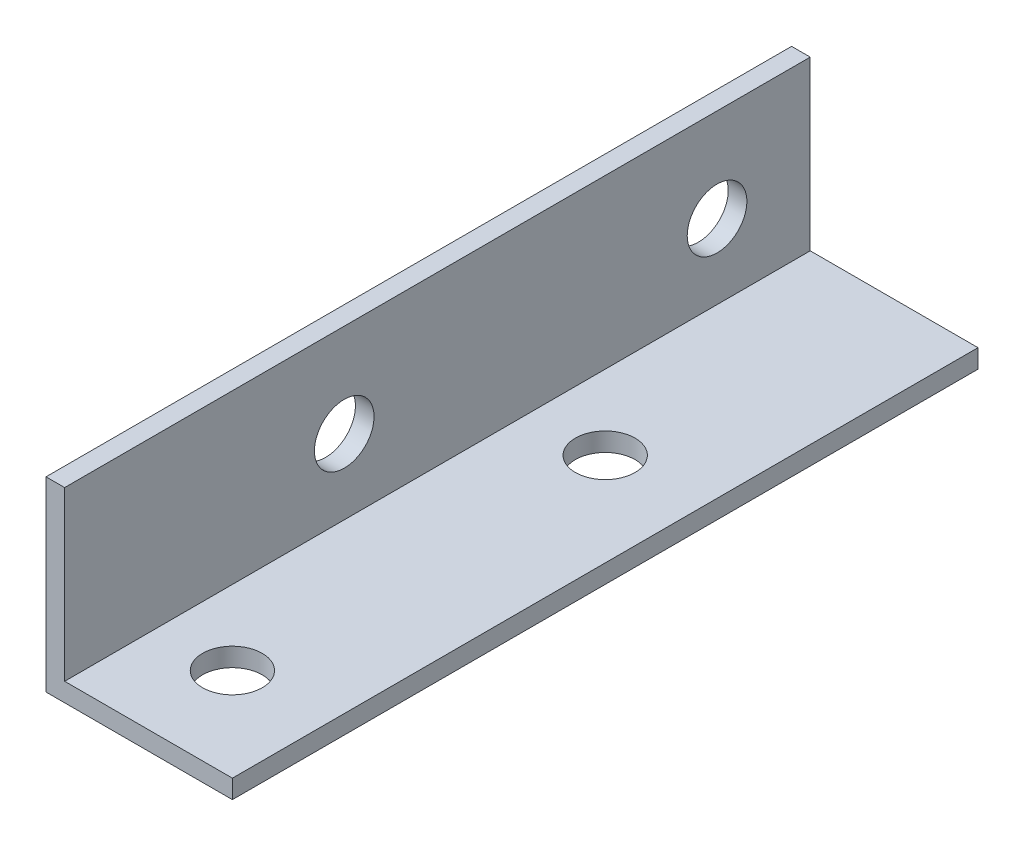
ISO-10303-21;
HEADER;
FILE_DESCRIPTION(('STEP AP214'),'2;1');
FILE_NAME('part.step','',(''),(''),'','','');
FILE_SCHEMA(('AUTOMOTIVE_DESIGN { 1 0 10303 214 1 1 1 1 }'));
ENDSEC;
DATA;
#1=APPLICATION_CONTEXT('core data for automotive mechanical design processes');
#2=APPLICATION_PROTOCOL_DEFINITION('international standard','automotive_design',2000,#1);
#3=PRODUCT_CONTEXT('',#1,'mechanical');
#4=PRODUCT('Part','Part','',(#3));
#5=PRODUCT_RELATED_PRODUCT_CATEGORY('part','',(#4));
#6=PRODUCT_DEFINITION_FORMATION('','',#4);
#7=PRODUCT_DEFINITION_CONTEXT('part definition',#1,'design');
#8=PRODUCT_DEFINITION('design','',#6,#7);
#9=PRODUCT_DEFINITION_SHAPE('','',#8);
#10=(LENGTH_UNIT() NAMED_UNIT(*) SI_UNIT(.MILLI.,.METRE.));
#11=(NAMED_UNIT(*) PLANE_ANGLE_UNIT() SI_UNIT($,.RADIAN.));
#12=(NAMED_UNIT(*) SI_UNIT($,.STERADIAN.) SOLID_ANGLE_UNIT());
#13=UNCERTAINTY_MEASURE_WITH_UNIT(LENGTH_MEASURE(1.E-05),#10,'distance_accuracy_value','');
#14=(GEOMETRIC_REPRESENTATION_CONTEXT(3) GLOBAL_UNCERTAINTY_ASSIGNED_CONTEXT((#13)) GLOBAL_UNIT_ASSIGNED_CONTEXT((#10,
#11,#12)) REPRESENTATION_CONTEXT('',''));
#15=CARTESIAN_POINT('',(0.,0.,0.));
#16=DIRECTION('',(0.,0.,1.));
#17=DIRECTION('',(1.,0.,0.));
#18=AXIS2_PLACEMENT_3D('',#15,#16,#17);
#19=CARTESIAN_POINT('',(-5.,-5.,40.));
#20=DIRECTION('',(1.,0.,0.));
#21=DIRECTION('',(0.,0.,-1.));
#22=AXIS2_PLACEMENT_3D('',#19,#20,#21);
#23=PLANE('',#22);
#24=CARTESIAN_POINT('',(-5.,0.,5.));
#25=DIRECTION('',(-1.,0.,0.));
#26=DIRECTION('',(0.,0.,1.));
#27=AXIS2_PLACEMENT_3D('',#24,#25,#26);
#28=CIRCLE('',#27,1.6);
#29=CARTESIAN_POINT('',(-5.,0.,6.6));
#30=VERTEX_POINT('',#29);
#31=EDGE_CURVE('E144',#30,#30,#28,.T.);
#32=ORIENTED_EDGE('',*,*,#31,.F.);
#33=EDGE_LOOP('',(#32));
#34=FACE_BOUND('',#33,.T.);
#35=CARTESIAN_POINT('',(-5.,0.,25.));
#36=DIRECTION('',(-1.,0.,0.));
#37=DIRECTION('',(0.,0.,1.));
#38=AXIS2_PLACEMENT_3D('',#35,#36,#37);
#39=CIRCLE('',#38,1.6);
#40=CARTESIAN_POINT('',(-5.,0.,26.6));
#41=VERTEX_POINT('',#40);
#42=EDGE_CURVE('E149',#41,#41,#39,.T.);
#43=ORIENTED_EDGE('',*,*,#42,.F.);
#44=EDGE_LOOP('',(#43));
#45=FACE_BOUND('',#44,.T.);
#46=DIRECTION('',(0.,-1.,0.));
#47=VECTOR('',#46,1.);
#48=CARTESIAN_POINT('',(-5.,-5.,0.));
#49=LINE('',#48,#47);
#50=CARTESIAN_POINT('',(-5.,5.,0.));
#51=VERTEX_POINT('',#50);
#52=CARTESIAN_POINT('',(-5.,-5.,0.));
#53=VERTEX_POINT('',#52);
#54=EDGE_CURVE('E119',#51,#53,#49,.T.);
#55=ORIENTED_EDGE('',*,*,#54,.T.);
#56=DIRECTION('',(0.,0.,-1.));
#57=VECTOR('',#56,1.);
#58=CARTESIAN_POINT('',(-5.,-5.,40.));
#59=LINE('',#58,#57);
#60=CARTESIAN_POINT('',(-5.,-5.,40.));
#61=VERTEX_POINT('',#60);
#62=EDGE_CURVE('E11',#61,#53,#59,.T.);
#63=ORIENTED_EDGE('',*,*,#62,.F.);
#64=DIRECTION('',(0.,-1.,0.));
#65=VECTOR('',#64,1.);
#66=CARTESIAN_POINT('',(-5.,-5.,40.));
#67=LINE('',#66,#65);
#68=CARTESIAN_POINT('',(-5.,5.,40.));
#69=VERTEX_POINT('',#68);
#70=EDGE_CURVE('E130',#69,#61,#67,.T.);
#71=ORIENTED_EDGE('',*,*,#70,.F.);
#72=DIRECTION('',(0.,0.,-1.));
#73=VECTOR('',#72,1.);
#74=CARTESIAN_POINT('',(-5.,5.,40.));
#75=LINE('',#74,#73);
#76=EDGE_CURVE('E115',#69,#51,#75,.T.);
#77=ORIENTED_EDGE('',*,*,#76,.T.);
#78=EDGE_LOOP('',(#55,#63,#71,#77));
#79=FACE_BOUND('',#78,.T.);
#80=ADVANCED_FACE('F33',(#34,#45,#79),#23,.F.);
#81=CARTESIAN_POINT('',(5.,-5.,40.));
#82=DIRECTION('',(0.,1.,0.));
#83=DIRECTION('',(-1.,0.,0.));
#84=AXIS2_PLACEMENT_3D('',#81,#82,#83);
#85=PLANE('',#84);
#86=CARTESIAN_POINT('',(0.,-5.,15.));
#87=DIRECTION('',(0.,1.,0.));
#88=DIRECTION('',(-1.,0.,0.));
#89=AXIS2_PLACEMENT_3D('',#86,#87,#88);
#90=CIRCLE('',#89,1.6);
#91=CARTESIAN_POINT('',(-1.6,-5.,15.));
#92=VERTEX_POINT('',#91);
#93=EDGE_CURVE('E123',#92,#92,#90,.T.);
#94=ORIENTED_EDGE('',*,*,#93,.T.);
#95=EDGE_LOOP('',(#94));
#96=FACE_BOUND('',#95,.T.);
#97=CARTESIAN_POINT('',(0.,-5.,35.));
#98=DIRECTION('',(0.,1.,0.));
#99=DIRECTION('',(-1.,0.,0.));
#100=AXIS2_PLACEMENT_3D('',#97,#98,#99);
#101=CIRCLE('',#100,1.6);
#102=CARTESIAN_POINT('',(-1.6,-5.,35.));
#103=VERTEX_POINT('',#102);
#104=EDGE_CURVE('E139',#103,#103,#101,.T.);
#105=ORIENTED_EDGE('',*,*,#104,.T.);
#106=EDGE_LOOP('',(#105));
#107=FACE_BOUND('',#106,.T.);
#108=DIRECTION('',(1.,0.,0.));
#109=VECTOR('',#108,1.);
#110=CARTESIAN_POINT('',(5.,-5.,0.));
#111=LINE('',#110,#109);
#112=CARTESIAN_POINT('',(5.,-5.,0.));
#113=VERTEX_POINT('',#112);
#114=EDGE_CURVE('E122',#53,#113,#111,.T.);
#115=ORIENTED_EDGE('',*,*,#114,.T.);
#116=DIRECTION('',(0.,0.,-1.));
#117=VECTOR('',#116,1.);
#118=CARTESIAN_POINT('',(5.,-5.,40.));
#119=LINE('',#118,#117);
#120=CARTESIAN_POINT('',(5.,-5.,40.));
#121=VERTEX_POINT('',#120);
#122=EDGE_CURVE('E42',#121,#113,#119,.T.);
#123=ORIENTED_EDGE('',*,*,#122,.F.);
#124=DIRECTION('',(1.,0.,0.));
#125=VECTOR('',#124,1.);
#126=CARTESIAN_POINT('',(5.,-5.,40.));
#127=LINE('',#126,#125);
#128=EDGE_CURVE('E88',#61,#121,#127,.T.);
#129=ORIENTED_EDGE('',*,*,#128,.F.);
#130=ORIENTED_EDGE('',*,*,#62,.T.);
#131=EDGE_LOOP('',(#115,#123,#129,#130));
#132=FACE_BOUND('',#131,.T.);
#133=ADVANCED_FACE('F163',(#96,#107,#132),#85,.F.);
#134=CARTESIAN_POINT('',(5.,-5.,40.));
#135=DIRECTION('',(-1.,0.,0.));
#136=DIRECTION('',(0.,0.,1.));
#137=AXIS2_PLACEMENT_3D('',#134,#135,#136);
#138=PLANE('',#137);
#139=DIRECTION('',(0.,1.,0.));
#140=VECTOR('',#139,1.);
#141=CARTESIAN_POINT('',(5.,-5.,0.));
#142=LINE('',#141,#140);
#143=CARTESIAN_POINT('',(5.,-4.,0.));
#144=VERTEX_POINT('',#143);
#145=EDGE_CURVE('E125',#113,#144,#142,.T.);
#146=ORIENTED_EDGE('',*,*,#145,.T.);
#147=DIRECTION('',(0.,0.,-1.));
#148=VECTOR('',#147,1.);
#149=CARTESIAN_POINT('',(5.,-4.,40.));
#150=LINE('',#149,#148);
#151=CARTESIAN_POINT('',(5.,-4.,40.));
#152=VERTEX_POINT('',#151);
#153=EDGE_CURVE('E110',#152,#144,#150,.T.);
#154=ORIENTED_EDGE('',*,*,#153,.F.);
#155=DIRECTION('',(0.,1.,0.));
#156=VECTOR('',#155,1.);
#157=CARTESIAN_POINT('',(5.,-5.,40.));
#158=LINE('',#157,#156);
#159=EDGE_CURVE('E101',#121,#152,#158,.T.);
#160=ORIENTED_EDGE('',*,*,#159,.F.);
#161=ORIENTED_EDGE('',*,*,#122,.T.);
#162=EDGE_LOOP('',(#146,#154,#160,#161));
#163=FACE_BOUND('',#162,.T.);
#164=ADVANCED_FACE('F166',(#163),#138,.F.);
#165=CARTESIAN_POINT('',(-4.,-4.,40.));
#166=DIRECTION('',(0.,-1.,0.));
#167=DIRECTION('',(0.,0.,-1.));
#168=AXIS2_PLACEMENT_3D('',#165,#166,#167);
#169=PLANE('',#168);
#170=CARTESIAN_POINT('',(0.,-4.,15.));
#171=DIRECTION('',(0.,-1.,0.));
#172=DIRECTION('',(0.,0.,-1.));
#173=AXIS2_PLACEMENT_3D('',#170,#171,#172);
#174=CIRCLE('',#173,1.6);
#175=CARTESIAN_POINT('',(0.,-4.,13.4));
#176=VERTEX_POINT('',#175);
#177=EDGE_CURVE('E140',#176,#176,#174,.T.);
#178=ORIENTED_EDGE('',*,*,#177,.T.);
#179=EDGE_LOOP('',(#178));
#180=FACE_BOUND('',#179,.T.);
#181=CARTESIAN_POINT('',(0.,-4.,35.));
#182=DIRECTION('',(0.,-1.,0.));
#183=DIRECTION('',(0.,0.,-1.));
#184=AXIS2_PLACEMENT_3D('',#181,#182,#183);
#185=CIRCLE('',#184,1.6);
#186=CARTESIAN_POINT('',(0.,-4.,33.4));
#187=VERTEX_POINT('',#186);
#188=EDGE_CURVE('E136',#187,#187,#185,.T.);
#189=ORIENTED_EDGE('',*,*,#188,.T.);
#190=EDGE_LOOP('',(#189));
#191=FACE_BOUND('',#190,.T.);
#192=DIRECTION('',(-1.,0.,0.));
#193=VECTOR('',#192,1.);
#194=CARTESIAN_POINT('',(-4.,-4.,0.));
#195=LINE('',#194,#193);
#196=CARTESIAN_POINT('',(-4.,-4.,0.));
#197=VERTEX_POINT('',#196);
#198=EDGE_CURVE('E109',#144,#197,#195,.T.);
#199=ORIENTED_EDGE('',*,*,#198,.T.);
#200=DIRECTION('',(0.,0.,-1.));
#201=VECTOR('',#200,1.);
#202=CARTESIAN_POINT('',(-4.,-4.,40.));
#203=LINE('',#202,#201);
#204=CARTESIAN_POINT('',(-4.,-4.,40.));
#205=VERTEX_POINT('',#204);
#206=EDGE_CURVE('E106',#205,#197,#203,.T.);
#207=ORIENTED_EDGE('',*,*,#206,.F.);
#208=DIRECTION('',(-1.,0.,0.));
#209=VECTOR('',#208,1.);
#210=CARTESIAN_POINT('',(-4.,-4.,40.));
#211=LINE('',#210,#209);
#212=EDGE_CURVE('E95',#152,#205,#211,.T.);
#213=ORIENTED_EDGE('',*,*,#212,.F.);
#214=ORIENTED_EDGE('',*,*,#153,.T.);
#215=EDGE_LOOP('',(#199,#207,#213,#214));
#216=FACE_BOUND('',#215,.T.);
#217=ADVANCED_FACE('F107',(#180,#191,#216),#169,.F.);
#218=CARTESIAN_POINT('',(-4.,5.,40.));
#219=DIRECTION('',(-1.,0.,0.));
#220=DIRECTION('',(0.,0.,1.));
#221=AXIS2_PLACEMENT_3D('',#218,#219,#220);
#222=PLANE('',#221);
#223=CARTESIAN_POINT('',(-4.,0.,5.));
#224=DIRECTION('',(-1.,0.,0.));
#225=DIRECTION('',(0.,0.,1.));
#226=AXIS2_PLACEMENT_3D('',#223,#224,#225);
#227=CIRCLE('',#226,1.6);
#228=CARTESIAN_POINT('',(-4.,0.,6.6));
#229=VERTEX_POINT('',#228);
#230=EDGE_CURVE('E36',#229,#229,#227,.T.);
#231=ORIENTED_EDGE('',*,*,#230,.T.);
#232=EDGE_LOOP('',(#231));
#233=FACE_BOUND('',#232,.T.);
#234=CARTESIAN_POINT('',(-4.,0.,25.));
#235=DIRECTION('',(-1.,0.,0.));
#236=DIRECTION('',(0.,0.,1.));
#237=AXIS2_PLACEMENT_3D('',#234,#235,#236);
#238=CIRCLE('',#237,1.6);
#239=CARTESIAN_POINT('',(-4.,0.,26.6));
#240=VERTEX_POINT('',#239);
#241=EDGE_CURVE('E142',#240,#240,#238,.T.);
#242=ORIENTED_EDGE('',*,*,#241,.T.);
#243=EDGE_LOOP('',(#242));
#244=FACE_BOUND('',#243,.T.);
#245=DIRECTION('',(0.,1.,0.));
#246=VECTOR('',#245,1.);
#247=CARTESIAN_POINT('',(-4.,5.,0.));
#248=LINE('',#247,#246);
#249=CARTESIAN_POINT('',(-4.,5.,0.));
#250=VERTEX_POINT('',#249);
#251=EDGE_CURVE('E74',#197,#250,#248,.T.);
#252=ORIENTED_EDGE('',*,*,#251,.T.);
#253=DIRECTION('',(0.,0.,-1.));
#254=VECTOR('',#253,1.);
#255=CARTESIAN_POINT('',(-4.,5.,40.));
#256=LINE('',#255,#254);
#257=CARTESIAN_POINT('',(-4.,5.,40.));
#258=VERTEX_POINT('',#257);
#259=EDGE_CURVE('E111',#258,#250,#256,.T.);
#260=ORIENTED_EDGE('',*,*,#259,.F.);
#261=DIRECTION('',(0.,1.,0.));
#262=VECTOR('',#261,1.);
#263=CARTESIAN_POINT('',(-4.,5.,40.));
#264=LINE('',#263,#262);
#265=EDGE_CURVE('E99',#205,#258,#264,.T.);
#266=ORIENTED_EDGE('',*,*,#265,.F.);
#267=ORIENTED_EDGE('',*,*,#206,.T.);
#268=EDGE_LOOP('',(#252,#260,#266,#267));
#269=FACE_BOUND('',#268,.T.);
#270=ADVANCED_FACE('F113',(#233,#244,#269),#222,.F.);
#271=CARTESIAN_POINT('',(-4.,5.,40.));
#272=DIRECTION('',(0.,-1.,0.));
#273=DIRECTION('',(0.,0.,-1.));
#274=AXIS2_PLACEMENT_3D('',#271,#272,#273);
#275=PLANE('',#274);
#276=DIRECTION('',(-1.,0.,0.));
#277=VECTOR('',#276,1.);
#278=CARTESIAN_POINT('',(-4.,5.,0.));
#279=LINE('',#278,#277);
#280=EDGE_CURVE('E80',#250,#51,#279,.T.);
#281=ORIENTED_EDGE('',*,*,#280,.T.);
#282=ORIENTED_EDGE('',*,*,#76,.F.);
#283=DIRECTION('',(-1.,0.,0.));
#284=VECTOR('',#283,1.);
#285=CARTESIAN_POINT('',(-4.,5.,40.));
#286=LINE('',#285,#284);
#287=EDGE_CURVE('E51',#258,#69,#286,.T.);
#288=ORIENTED_EDGE('',*,*,#287,.F.);
#289=ORIENTED_EDGE('',*,*,#259,.T.);
#290=EDGE_LOOP('',(#281,#282,#288,#289));
#291=FACE_BOUND('',#290,.T.);
#292=ADVANCED_FACE('F171',(#291),#275,.F.);
#293=CARTESIAN_POINT('',(0.,0.,40.));
#294=DIRECTION('',(0.,0.,1.));
#295=DIRECTION('',(1.,0.,0.));
#296=AXIS2_PLACEMENT_3D('',#293,#294,#295);
#297=PLANE('',#296);
#298=ORIENTED_EDGE('',*,*,#70,.T.);
#299=ORIENTED_EDGE('',*,*,#128,.T.);
#300=ORIENTED_EDGE('',*,*,#159,.T.);
#301=ORIENTED_EDGE('',*,*,#212,.T.);
#302=ORIENTED_EDGE('',*,*,#265,.T.);
#303=ORIENTED_EDGE('',*,*,#287,.T.);
#304=EDGE_LOOP('',(#298,#299,#300,#301,#302,#303));
#305=FACE_BOUND('',#304,.T.);
#306=ADVANCED_FACE('F97',(#305),#297,.T.);
#307=CARTESIAN_POINT('',(0.,0.,0.));
#308=DIRECTION('',(0.,0.,1.));
#309=DIRECTION('',(1.,0.,0.));
#310=AXIS2_PLACEMENT_3D('',#307,#308,#309);
#311=PLANE('',#310);
#312=ORIENTED_EDGE('',*,*,#54,.F.);
#313=ORIENTED_EDGE('',*,*,#280,.F.);
#314=ORIENTED_EDGE('',*,*,#251,.F.);
#315=ORIENTED_EDGE('',*,*,#198,.F.);
#316=ORIENTED_EDGE('',*,*,#145,.F.);
#317=ORIENTED_EDGE('',*,*,#114,.F.);
#318=EDGE_LOOP('',(#312,#313,#314,#315,#316,#317));
#319=FACE_BOUND('',#318,.T.);
#320=ADVANCED_FACE('F169',(#319),#311,.F.);
#321=CARTESIAN_POINT('',(0.,5.,35.));
#322=DIRECTION('',(0.,-1.,0.));
#323=DIRECTION('',(1.,0.,0.));
#324=AXIS2_PLACEMENT_3D('',#321,#322,#323);
#325=CYLINDRICAL_SURFACE('',#324,1.6);
#326=ORIENTED_EDGE('',*,*,#188,.F.);
#327=EDGE_LOOP('',(#326));
#328=FACE_BOUND('',#327,.T.);
#329=ORIENTED_EDGE('',*,*,#104,.F.);
#330=EDGE_LOOP('',(#329));
#331=FACE_BOUND('',#330,.T.);
#332=ADVANCED_FACE('F202',(#328,#331),#325,.F.);
#333=CARTESIAN_POINT('',(0.,5.,15.));
#334=DIRECTION('',(0.,-1.,0.));
#335=DIRECTION('',(1.,0.,0.));
#336=AXIS2_PLACEMENT_3D('',#333,#334,#335);
#337=CYLINDRICAL_SURFACE('',#336,1.6);
#338=ORIENTED_EDGE('',*,*,#177,.F.);
#339=EDGE_LOOP('',(#338));
#340=FACE_BOUND('',#339,.T.);
#341=ORIENTED_EDGE('',*,*,#93,.F.);
#342=EDGE_LOOP('',(#341));
#343=FACE_BOUND('',#342,.T.);
#344=ADVANCED_FACE('F195',(#340,#343),#337,.F.);
#345=CARTESIAN_POINT('',(5.,0.,25.));
#346=DIRECTION('',(-1.,0.,0.));
#347=DIRECTION('',(0.,0.,1.));
#348=AXIS2_PLACEMENT_3D('',#345,#346,#347);
#349=CYLINDRICAL_SURFACE('',#348,1.6);
#350=ORIENTED_EDGE('',*,*,#42,.T.);
#351=EDGE_LOOP('',(#350));
#352=FACE_BOUND('',#351,.T.);
#353=ORIENTED_EDGE('',*,*,#241,.F.);
#354=EDGE_LOOP('',(#353));
#355=FACE_BOUND('',#354,.T.);
#356=ADVANCED_FACE('F191',(#352,#355),#349,.F.);
#357=CARTESIAN_POINT('',(5.,0.,5.));
#358=DIRECTION('',(-1.,0.,0.));
#359=DIRECTION('',(0.,0.,1.));
#360=AXIS2_PLACEMENT_3D('',#357,#358,#359);
#361=CYLINDRICAL_SURFACE('',#360,1.6);
#362=ORIENTED_EDGE('',*,*,#31,.T.);
#363=EDGE_LOOP('',(#362));
#364=FACE_BOUND('',#363,.T.);
#365=ORIENTED_EDGE('',*,*,#230,.F.);
#366=EDGE_LOOP('',(#365));
#367=FACE_BOUND('',#366,.T.);
#368=ADVANCED_FACE('F194',(#364,#367),#361,.F.);
#369=CLOSED_SHELL('',(#80,#133,#164,#217,#270,#292,#306,#320,#332,#344,#356,#368));
#370=MANIFOLD_SOLID_BREP('B2',#369);
#371=ADVANCED_BREP_SHAPE_REPRESENTATION('',(#18,#370),#14);
#372=SHAPE_DEFINITION_REPRESENTATION(#9,#371);
ENDSEC;
END-ISO-10303-21;
